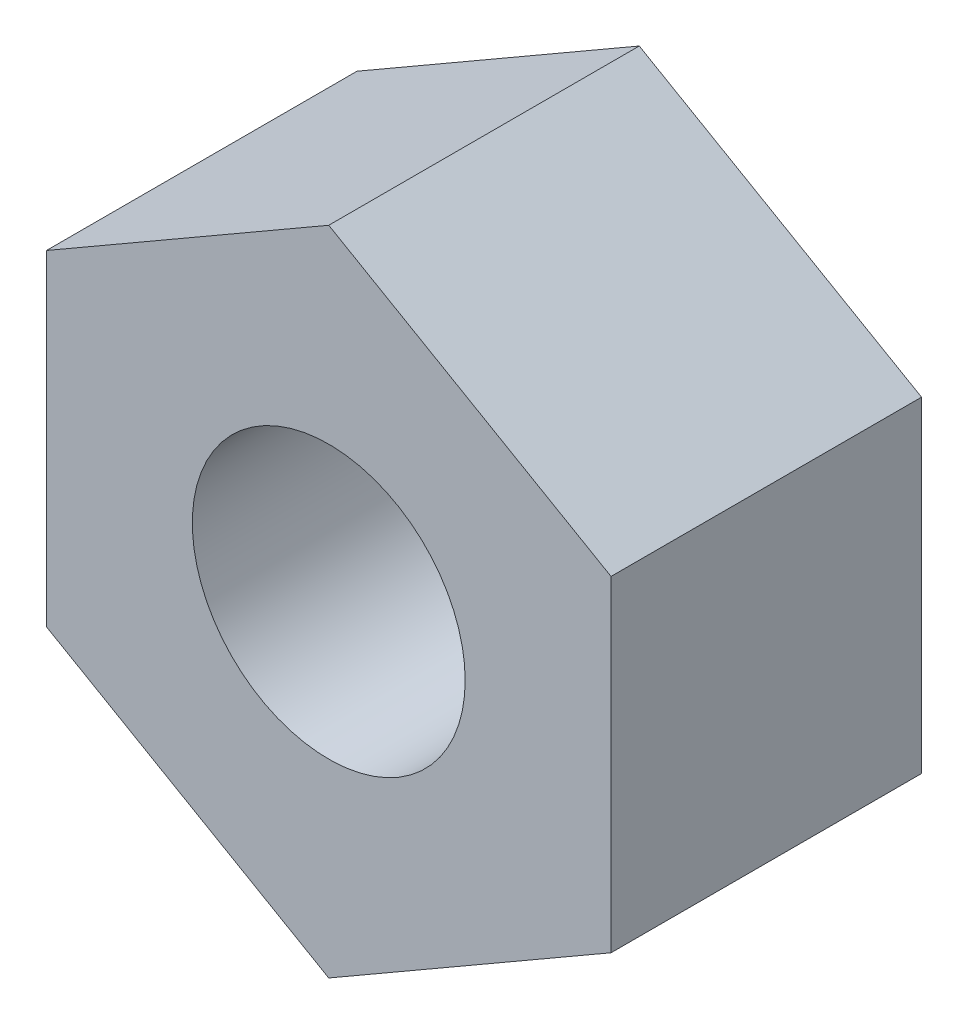
ISO-10303-21;
HEADER;
FILE_DESCRIPTION(('STEP AP214'),'2;1');
FILE_NAME('part.step','',(''),(''),'','','');
FILE_SCHEMA(('AUTOMOTIVE_DESIGN { 1 0 10303 214 1 1 1 1 }'));
ENDSEC;
DATA;
#1=APPLICATION_CONTEXT('core data for automotive mechanical design processes');
#2=APPLICATION_PROTOCOL_DEFINITION('international standard','automotive_design',2000,#1);
#3=PRODUCT_CONTEXT('',#1,'mechanical');
#4=PRODUCT('Part','Part','',(#3));
#5=PRODUCT_RELATED_PRODUCT_CATEGORY('part','',(#4));
#6=PRODUCT_DEFINITION_FORMATION('','',#4);
#7=PRODUCT_DEFINITION_CONTEXT('part definition',#1,'design');
#8=PRODUCT_DEFINITION('design','',#6,#7);
#9=PRODUCT_DEFINITION_SHAPE('','',#8);
#10=(LENGTH_UNIT() NAMED_UNIT(*) SI_UNIT(.MILLI.,.METRE.));
#11=(NAMED_UNIT(*) PLANE_ANGLE_UNIT() SI_UNIT($,.RADIAN.));
#12=(NAMED_UNIT(*) SI_UNIT($,.STERADIAN.) SOLID_ANGLE_UNIT());
#13=UNCERTAINTY_MEASURE_WITH_UNIT(LENGTH_MEASURE(1.E-05),#10,'distance_accuracy_value','');
#14=(GEOMETRIC_REPRESENTATION_CONTEXT(3) GLOBAL_UNCERTAINTY_ASSIGNED_CONTEXT((#13)) GLOBAL_UNIT_ASSIGNED_CONTEXT((#10,
#11,#12)) REPRESENTATION_CONTEXT('',''));
#15=CARTESIAN_POINT('',(0.,0.,0.));
#16=DIRECTION('',(0.,0.,1.));
#17=DIRECTION('',(1.,0.,0.));
#18=AXIS2_PLACEMENT_3D('',#15,#16,#17);
#19=CARTESIAN_POINT('',(0.,3.46410161513776,-3.3));
#20=DIRECTION('',(-0.500000000000001,0.866025403784438,0.));
#21=DIRECTION('',(-0.866025403784438,-0.500000000000001,0.));
#22=AXIS2_PLACEMENT_3D('',#19,#20,#21);
#23=PLANE('',#22);
#24=DIRECTION('',(-0.866025403784438,-0.500000000000001,0.));
#25=VECTOR('',#24,1.);
#26=CARTESIAN_POINT('',(0.,3.46410161513776,0.));
#27=LINE('',#26,#25);
#28=CARTESIAN_POINT('',(0.,3.46410161513776,0.));
#29=VERTEX_POINT('',#28);
#30=CARTESIAN_POINT('',(-3.,1.73205080756888,0.));
#31=VERTEX_POINT('',#30);
#32=EDGE_CURVE('E122',#29,#31,#27,.T.);
#33=ORIENTED_EDGE('',*,*,#32,.F.);
#34=DIRECTION('',(0.,0.,1.));
#35=VECTOR('',#34,1.);
#36=CARTESIAN_POINT('',(0.,3.46410161513776,-3.3));
#37=LINE('',#36,#35);
#38=CARTESIAN_POINT('',(0.,3.46410161513776,-3.3));
#39=VERTEX_POINT('',#38);
#40=EDGE_CURVE('E11',#39,#29,#37,.T.);
#41=ORIENTED_EDGE('',*,*,#40,.F.);
#42=DIRECTION('',(-0.866025403784438,-0.500000000000001,0.));
#43=VECTOR('',#42,1.);
#44=CARTESIAN_POINT('',(0.,3.46410161513776,-3.3));
#45=LINE('',#44,#43);
#46=CARTESIAN_POINT('',(-3.,1.73205080756888,-3.3));
#47=VERTEX_POINT('',#46);
#48=EDGE_CURVE('E137',#39,#47,#45,.T.);
#49=ORIENTED_EDGE('',*,*,#48,.T.);
#50=DIRECTION('',(0.,0.,1.));
#51=VECTOR('',#50,1.);
#52=CARTESIAN_POINT('',(-3.,1.73205080756888,-3.3));
#53=LINE('',#52,#51);
#54=EDGE_CURVE('E40',#47,#31,#53,.T.);
#55=ORIENTED_EDGE('',*,*,#54,.T.);
#56=EDGE_LOOP('',(#33,#41,#49,#55));
#57=FACE_BOUND('',#56,.T.);
#58=ADVANCED_FACE('F37',(#57),#23,.T.);
#59=CARTESIAN_POINT('',(3.,1.73205080756888,-3.3));
#60=DIRECTION('',(0.500000000000001,0.866025403784438,0.));
#61=DIRECTION('',(-0.866025403784438,0.500000000000001,0.));
#62=AXIS2_PLACEMENT_3D('',#59,#60,#61);
#63=PLANE('',#62);
#64=DIRECTION('',(-0.866025403784438,0.500000000000001,0.));
#65=VECTOR('',#64,1.);
#66=CARTESIAN_POINT('',(3.,1.73205080756888,0.));
#67=LINE('',#66,#65);
#68=CARTESIAN_POINT('',(3.,1.73205080756888,0.));
#69=VERTEX_POINT('',#68);
#70=EDGE_CURVE('E135',#69,#29,#67,.T.);
#71=ORIENTED_EDGE('',*,*,#70,.F.);
#72=DIRECTION('',(0.,0.,1.));
#73=VECTOR('',#72,1.);
#74=CARTESIAN_POINT('',(3.,1.73205080756888,-3.3));
#75=LINE('',#74,#73);
#76=CARTESIAN_POINT('',(3.,1.73205080756888,-3.3));
#77=VERTEX_POINT('',#76);
#78=EDGE_CURVE('E46',#77,#69,#75,.T.);
#79=ORIENTED_EDGE('',*,*,#78,.F.);
#80=DIRECTION('',(-0.866025403784438,0.500000000000001,0.));
#81=VECTOR('',#80,1.);
#82=CARTESIAN_POINT('',(3.,1.73205080756888,-3.3));
#83=LINE('',#82,#81);
#84=EDGE_CURVE('E104',#77,#39,#83,.T.);
#85=ORIENTED_EDGE('',*,*,#84,.T.);
#86=ORIENTED_EDGE('',*,*,#40,.T.);
#87=EDGE_LOOP('',(#71,#79,#85,#86));
#88=FACE_BOUND('',#87,.T.);
#89=ADVANCED_FACE('F145',(#88),#63,.T.);
#90=CARTESIAN_POINT('',(3.,1.73205080756888,-3.3));
#91=DIRECTION('',(-1.,0.,0.));
#92=DIRECTION('',(0.,0.,1.));
#93=AXIS2_PLACEMENT_3D('',#90,#91,#92);
#94=PLANE('',#93);
#95=DIRECTION('',(0.,-1.,0.));
#96=VECTOR('',#95,1.);
#97=CARTESIAN_POINT('',(3.,1.73205080756888,0.));
#98=LINE('',#97,#96);
#99=CARTESIAN_POINT('',(3.,-1.73205080756888,0.));
#100=VERTEX_POINT('',#99);
#101=EDGE_CURVE('E108',#69,#100,#98,.T.);
#102=ORIENTED_EDGE('',*,*,#101,.T.);
#103=DIRECTION('',(0.,0.,1.));
#104=VECTOR('',#103,1.);
#105=CARTESIAN_POINT('',(3.,-1.73205080756888,-3.3));
#106=LINE('',#105,#104);
#107=CARTESIAN_POINT('',(3.,-1.73205080756888,-3.3));
#108=VERTEX_POINT('',#107);
#109=EDGE_CURVE('E106',#108,#100,#106,.T.);
#110=ORIENTED_EDGE('',*,*,#109,.F.);
#111=DIRECTION('',(0.,-1.,0.));
#112=VECTOR('',#111,1.);
#113=CARTESIAN_POINT('',(3.,1.73205080756888,-3.3));
#114=LINE('',#113,#112);
#115=EDGE_CURVE('E97',#77,#108,#114,.T.);
#116=ORIENTED_EDGE('',*,*,#115,.F.);
#117=ORIENTED_EDGE('',*,*,#78,.T.);
#118=EDGE_LOOP('',(#102,#110,#116,#117));
#119=FACE_BOUND('',#118,.T.);
#120=ADVANCED_FACE('F107',(#119),#94,.F.);
#121=CARTESIAN_POINT('',(0.,-3.46410161513776,-3.3));
#122=DIRECTION('',(0.500000000000001,-0.866025403784438,0.));
#123=DIRECTION('',(0.866025403784438,0.500000000000001,0.));
#124=AXIS2_PLACEMENT_3D('',#121,#122,#123);
#125=PLANE('',#124);
#126=DIRECTION('',(0.866025403784438,0.500000000000001,0.));
#127=VECTOR('',#126,1.);
#128=CARTESIAN_POINT('',(0.,-3.46410161513776,0.));
#129=LINE('',#128,#127);
#130=CARTESIAN_POINT('',(0.,-3.46410161513776,0.));
#131=VERTEX_POINT('',#130);
#132=EDGE_CURVE('E132',#131,#100,#129,.T.);
#133=ORIENTED_EDGE('',*,*,#132,.F.);
#134=DIRECTION('',(0.,0.,1.));
#135=VECTOR('',#134,1.);
#136=CARTESIAN_POINT('',(0.,-3.46410161513776,-3.3));
#137=LINE('',#136,#135);
#138=CARTESIAN_POINT('',(0.,-3.46410161513776,-3.3));
#139=VERTEX_POINT('',#138);
#140=EDGE_CURVE('E112',#139,#131,#137,.T.);
#141=ORIENTED_EDGE('',*,*,#140,.F.);
#142=DIRECTION('',(0.866025403784438,0.500000000000001,0.));
#143=VECTOR('',#142,1.);
#144=CARTESIAN_POINT('',(0.,-3.46410161513776,-3.3));
#145=LINE('',#144,#143);
#146=EDGE_CURVE('E102',#139,#108,#145,.T.);
#147=ORIENTED_EDGE('',*,*,#146,.T.);
#148=ORIENTED_EDGE('',*,*,#109,.T.);
#149=EDGE_LOOP('',(#133,#141,#147,#148));
#150=FACE_BOUND('',#149,.T.);
#151=ADVANCED_FACE('F114',(#150),#125,.T.);
#152=CARTESIAN_POINT('',(-3.,-1.73205080756888,-3.3));
#153=DIRECTION('',(-0.500000000000001,-0.866025403784438,0.));
#154=DIRECTION('',(0.866025403784438,-0.500000000000001,0.));
#155=AXIS2_PLACEMENT_3D('',#152,#153,#154);
#156=PLANE('',#155);
#157=DIRECTION('',(0.866025403784438,-0.500000000000001,0.));
#158=VECTOR('',#157,1.);
#159=CARTESIAN_POINT('',(-3.,-1.73205080756888,0.));
#160=LINE('',#159,#158);
#161=CARTESIAN_POINT('',(-3.,-1.73205080756888,0.));
#162=VERTEX_POINT('',#161);
#163=EDGE_CURVE('E129',#162,#131,#160,.T.);
#164=ORIENTED_EDGE('',*,*,#163,.F.);
#165=DIRECTION('',(0.,0.,1.));
#166=VECTOR('',#165,1.);
#167=CARTESIAN_POINT('',(-3.,-1.73205080756888,-3.3));
#168=LINE('',#167,#166);
#169=CARTESIAN_POINT('',(-3.,-1.73205080756888,-3.3));
#170=VERTEX_POINT('',#169);
#171=EDGE_CURVE('E140',#170,#162,#168,.T.);
#172=ORIENTED_EDGE('',*,*,#171,.F.);
#173=DIRECTION('',(0.866025403784438,-0.500000000000001,0.));
#174=VECTOR('',#173,1.);
#175=CARTESIAN_POINT('',(-3.,-1.73205080756888,-3.3));
#176=LINE('',#175,#174);
#177=EDGE_CURVE('E115',#170,#139,#176,.T.);
#178=ORIENTED_EDGE('',*,*,#177,.T.);
#179=ORIENTED_EDGE('',*,*,#140,.T.);
#180=EDGE_LOOP('',(#164,#172,#178,#179));
#181=FACE_BOUND('',#180,.T.);
#182=ADVANCED_FACE('F158',(#181),#156,.T.);
#183=CARTESIAN_POINT('',(-3.,1.73205080756888,-3.3));
#184=DIRECTION('',(-1.,0.,0.));
#185=DIRECTION('',(0.,0.,1.));
#186=AXIS2_PLACEMENT_3D('',#183,#184,#185);
#187=PLANE('',#186);
#188=DIRECTION('',(0.,-1.,0.));
#189=VECTOR('',#188,1.);
#190=CARTESIAN_POINT('',(-3.,1.73205080756888,0.));
#191=LINE('',#190,#189);
#192=EDGE_CURVE('E125',#31,#162,#191,.T.);
#193=ORIENTED_EDGE('',*,*,#192,.F.);
#194=ORIENTED_EDGE('',*,*,#54,.F.);
#195=DIRECTION('',(0.,-1.,0.));
#196=VECTOR('',#195,1.);
#197=CARTESIAN_POINT('',(-3.,1.73205080756888,-3.3));
#198=LINE('',#197,#196);
#199=EDGE_CURVE('E117',#47,#170,#198,.T.);
#200=ORIENTED_EDGE('',*,*,#199,.T.);
#201=ORIENTED_EDGE('',*,*,#171,.T.);
#202=EDGE_LOOP('',(#193,#194,#200,#201));
#203=FACE_BOUND('',#202,.T.);
#204=ADVANCED_FACE('F142',(#203),#187,.T.);
#205=CARTESIAN_POINT('',(-5.99999999999999,0.,-3.3));
#206=DIRECTION('',(0.,0.,1.));
#207=DIRECTION('',(1.,0.,0.));
#208=AXIS2_PLACEMENT_3D('',#205,#206,#207);
#209=PLANE('',#208);
#210=CARTESIAN_POINT('',(0.,0.,-3.3));
#211=DIRECTION('',(0.,0.,1.));
#212=DIRECTION('',(1.,0.,0.));
#213=AXIS2_PLACEMENT_3D('',#210,#211,#212);
#214=CIRCLE('',#213,1.45);
#215=CARTESIAN_POINT('',(1.45,0.,-3.3));
#216=VERTEX_POINT('',#215);
#217=EDGE_CURVE('E126',#216,#216,#214,.T.);
#218=ORIENTED_EDGE('',*,*,#217,.T.);
#219=EDGE_LOOP('',(#218));
#220=FACE_BOUND('',#219,.T.);
#221=ORIENTED_EDGE('',*,*,#48,.F.);
#222=ORIENTED_EDGE('',*,*,#84,.F.);
#223=ORIENTED_EDGE('',*,*,#115,.T.);
#224=ORIENTED_EDGE('',*,*,#146,.F.);
#225=ORIENTED_EDGE('',*,*,#177,.F.);
#226=ORIENTED_EDGE('',*,*,#199,.F.);
#227=EDGE_LOOP('',(#221,#222,#223,#224,#225,#226));
#228=FACE_BOUND('',#227,.T.);
#229=ADVANCED_FACE('F99',(#220,#228),#209,.F.);
#230=CARTESIAN_POINT('',(-5.99999999999999,0.,0.));
#231=DIRECTION('',(0.,0.,1.));
#232=DIRECTION('',(1.,0.,0.));
#233=AXIS2_PLACEMENT_3D('',#230,#231,#232);
#234=PLANE('',#233);
#235=CARTESIAN_POINT('',(0.,0.,0.));
#236=DIRECTION('',(0.,0.,1.));
#237=DIRECTION('',(1.,0.,0.));
#238=AXIS2_PLACEMENT_3D('',#235,#236,#237);
#239=CIRCLE('',#238,1.45);
#240=CARTESIAN_POINT('',(1.45,0.,0.));
#241=VERTEX_POINT('',#240);
#242=EDGE_CURVE('E181',#241,#241,#239,.T.);
#243=ORIENTED_EDGE('',*,*,#242,.F.);
#244=EDGE_LOOP('',(#243));
#245=FACE_BOUND('',#244,.T.);
#246=ORIENTED_EDGE('',*,*,#32,.T.);
#247=ORIENTED_EDGE('',*,*,#192,.T.);
#248=ORIENTED_EDGE('',*,*,#163,.T.);
#249=ORIENTED_EDGE('',*,*,#132,.T.);
#250=ORIENTED_EDGE('',*,*,#101,.F.);
#251=ORIENTED_EDGE('',*,*,#70,.T.);
#252=EDGE_LOOP('',(#246,#247,#248,#249,#250,#251));
#253=FACE_BOUND('',#252,.T.);
#254=ADVANCED_FACE('F144',(#245,#253),#234,.T.);
#255=CARTESIAN_POINT('',(0.,0.,-3.3));
#256=DIRECTION('',(0.,0.,1.));
#257=DIRECTION('',(1.,0.,0.));
#258=AXIS2_PLACEMENT_3D('',#255,#256,#257);
#259=CYLINDRICAL_SURFACE('',#258,1.45);
#260=ORIENTED_EDGE('',*,*,#217,.F.);
#261=EDGE_LOOP('',(#260));
#262=FACE_BOUND('',#261,.T.);
#263=ORIENTED_EDGE('',*,*,#242,.T.);
#264=EDGE_LOOP('',(#263));
#265=FACE_BOUND('',#264,.T.);
#266=ADVANCED_FACE('F169',(#262,#265),#259,.F.);
#267=CLOSED_SHELL('',(#58,#89,#120,#151,#182,#204,#229,#254,#266));
#268=MANIFOLD_SOLID_BREP('B2',#267);
#269=ADVANCED_BREP_SHAPE_REPRESENTATION('',(#18,#268),#14);
#270=SHAPE_DEFINITION_REPRESENTATION(#9,#269);
ENDSEC;
END-ISO-10303-21;
